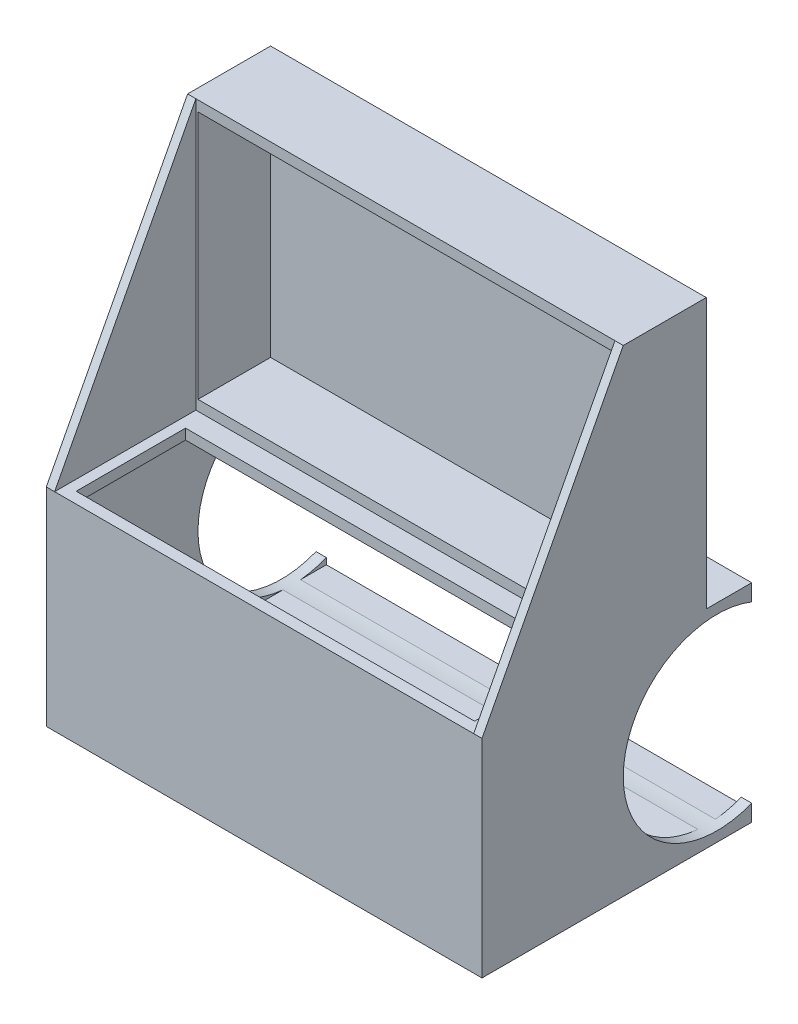
ISO-10303-21;
HEADER;
FILE_DESCRIPTION(('STEP AP214'),'2;1');
FILE_NAME('part.step','',(''),(''),'','','');
FILE_SCHEMA(('AUTOMOTIVE_DESIGN { 1 0 10303 214 1 1 1 1 }'));
ENDSEC;
DATA;
#1=APPLICATION_CONTEXT('core data for automotive mechanical design processes');
#2=APPLICATION_PROTOCOL_DEFINITION('international standard','automotive_design',2000,#1);
#3=PRODUCT_CONTEXT('',#1,'mechanical');
#4=PRODUCT('Part','Part','',(#3));
#5=PRODUCT_RELATED_PRODUCT_CATEGORY('part','',(#4));
#6=PRODUCT_DEFINITION_FORMATION('','',#4);
#7=PRODUCT_DEFINITION_CONTEXT('part definition',#1,'design');
#8=PRODUCT_DEFINITION('design','',#6,#7);
#9=PRODUCT_DEFINITION_SHAPE('','',#8);
#10=(LENGTH_UNIT() NAMED_UNIT(*) SI_UNIT(.MILLI.,.METRE.));
#11=(NAMED_UNIT(*) PLANE_ANGLE_UNIT() SI_UNIT($,.RADIAN.));
#12=(NAMED_UNIT(*) SI_UNIT($,.STERADIAN.) SOLID_ANGLE_UNIT());
#13=UNCERTAINTY_MEASURE_WITH_UNIT(LENGTH_MEASURE(1.E-05),#10,'distance_accuracy_value','');
#14=(GEOMETRIC_REPRESENTATION_CONTEXT(3) GLOBAL_UNCERTAINTY_ASSIGNED_CONTEXT((#13)) GLOBAL_UNIT_ASSIGNED_CONTEXT((#10,
#11,#12)) REPRESENTATION_CONTEXT('',''));
#15=CARTESIAN_POINT('',(0.,0.,0.));
#16=DIRECTION('',(0.,0.,1.));
#17=DIRECTION('',(1.,0.,0.));
#18=AXIS2_PLACEMENT_3D('',#15,#16,#17);
#19=CARTESIAN_POINT('',(-105.,50.,130.));
#20=DIRECTION('',(0.,-1.,0.));
#21=DIRECTION('',(0.,0.,-1.));
#22=AXIS2_PLACEMENT_3D('',#19,#20,#21);
#23=PLANE('',#22);
#24=DIRECTION('',(-1.,0.,0.));
#25=VECTOR('',#24,1.);
#26=CARTESIAN_POINT('',(-96.,50.,71.9000648381955));
#27=LINE('',#26,#25);
#28=CARTESIAN_POINT('',(95.9999999999999,50.,71.9000648381955));
#29=VERTEX_POINT('',#28);
#30=CARTESIAN_POINT('',(-96.,50.,71.9000648381955));
#31=VERTEX_POINT('',#30);
#32=EDGE_CURVE('E297',#29,#31,#27,.T.);
#33=ORIENTED_EDGE('',*,*,#32,.F.);
#34=DIRECTION('',(0.,0.,-1.));
#35=VECTOR('',#34,1.);
#36=CARTESIAN_POINT('',(95.9999999999999,50.,71.9000648381955));
#37=LINE('',#36,#35);
#38=CARTESIAN_POINT('',(96.,50.,124.589762262162));
#39=VERTEX_POINT('',#38);
#40=EDGE_CURVE('E65',#39,#29,#37,.T.);
#41=ORIENTED_EDGE('',*,*,#40,.F.);
#42=DIRECTION('',(1.,0.,0.));
#43=VECTOR('',#42,1.);
#44=CARTESIAN_POINT('',(-96.,50.,124.589762262162));
#45=LINE('',#44,#43);
#46=CARTESIAN_POINT('',(-96.,50.,124.589762262162));
#47=VERTEX_POINT('',#46);
#48=EDGE_CURVE('E288',#47,#39,#45,.T.);
#49=ORIENTED_EDGE('',*,*,#48,.F.);
#50=DIRECTION('',(0.,0.,1.));
#51=VECTOR('',#50,1.);
#52=CARTESIAN_POINT('',(-96.,50.,71.9000648381955));
#53=LINE('',#52,#51);
#54=EDGE_CURVE('E291',#31,#47,#53,.T.);
#55=ORIENTED_EDGE('',*,*,#54,.F.);
#56=EDGE_LOOP('',(#33,#41,#49,#55));
#57=FACE_BOUND('',#56,.T.);
#58=DIRECTION('',(0.,0.,-1.));
#59=VECTOR('',#58,1.);
#60=CARTESIAN_POINT('',(-101.,50.,0.));
#61=LINE('',#60,#59);
#62=CARTESIAN_POINT('',(-101.,50.,130.));
#63=VERTEX_POINT('',#62);
#64=CARTESIAN_POINT('',(-101.,50.,61.9000648381956));
#65=VERTEX_POINT('',#64);
#66=EDGE_CURVE('E312',#63,#65,#61,.T.);
#67=ORIENTED_EDGE('',*,*,#66,.F.);
#68=DIRECTION('',(-1.,0.,0.));
#69=VECTOR('',#68,1.);
#70=CARTESIAN_POINT('',(-105.,50.,130.));
#71=LINE('',#70,#69);
#72=CARTESIAN_POINT('',(101.,50.,130.));
#73=VERTEX_POINT('',#72);
#74=EDGE_CURVE('E487',#73,#63,#71,.T.);
#75=ORIENTED_EDGE('',*,*,#74,.F.);
#76=DIRECTION('',(0.,0.,1.));
#77=VECTOR('',#76,1.);
#78=CARTESIAN_POINT('',(101.,50.,0.));
#79=LINE('',#78,#77);
#80=CARTESIAN_POINT('',(101.,50.,61.9000648381956));
#81=VERTEX_POINT('',#80);
#82=EDGE_CURVE('E322',#81,#73,#79,.T.);
#83=ORIENTED_EDGE('',*,*,#82,.F.);
#84=DIRECTION('',(1.,0.,0.));
#85=VECTOR('',#84,1.);
#86=CARTESIAN_POINT('',(-105.,50.,61.9000648381956));
#87=LINE('',#86,#85);
#88=EDGE_CURVE('E376',#65,#81,#87,.T.);
#89=ORIENTED_EDGE('',*,*,#88,.F.);
#90=EDGE_LOOP('',(#67,#75,#83,#89));
#91=FACE_BOUND('',#90,.T.);
#92=ADVANCED_FACE('F49',(#57,#91),#23,.F.);
#93=CARTESIAN_POINT('',(-105.,50.,61.9000648381956));
#94=DIRECTION('',(0.,0.,1.));
#95=DIRECTION('',(1.,0.,0.));
#96=AXIS2_PLACEMENT_3D('',#93,#94,#95);
#97=PLANE('',#96);
#98=DIRECTION('',(0.,1.,0.));
#99=VECTOR('',#98,1.);
#100=CARTESIAN_POINT('',(99.9999999999999,175.,61.9000648381956));
#101=LINE('',#100,#99);
#102=CARTESIAN_POINT('',(99.9999999999999,55.,61.9000648381956));
#103=VERTEX_POINT('',#102);
#104=CARTESIAN_POINT('',(99.9999999999999,175.,61.9000648381956));
#105=VERTEX_POINT('',#104);
#106=EDGE_CURVE('E331',#103,#105,#101,.T.);
#107=ORIENTED_EDGE('',*,*,#106,.F.);
#108=DIRECTION('',(1.,0.,0.));
#109=VECTOR('',#108,1.);
#110=CARTESIAN_POINT('',(-100.,55.,61.9000648381956));
#111=LINE('',#110,#109);
#112=CARTESIAN_POINT('',(-100.,55.,61.9000648381956));
#113=VERTEX_POINT('',#112);
#114=EDGE_CURVE('E336',#113,#103,#111,.T.);
#115=ORIENTED_EDGE('',*,*,#114,.F.);
#116=DIRECTION('',(0.,-1.,0.));
#117=VECTOR('',#116,1.);
#118=CARTESIAN_POINT('',(-100.,175.,61.9000648381956));
#119=LINE('',#118,#117);
#120=CARTESIAN_POINT('',(-100.,175.,61.9000648381956));
#121=VERTEX_POINT('',#120);
#122=EDGE_CURVE('E350',#121,#113,#119,.T.);
#123=ORIENTED_EDGE('',*,*,#122,.F.);
#124=DIRECTION('',(-1.,0.,0.));
#125=VECTOR('',#124,1.);
#126=CARTESIAN_POINT('',(-100.,175.,61.9000648381956));
#127=LINE('',#126,#125);
#128=EDGE_CURVE('E347',#105,#121,#127,.T.);
#129=ORIENTED_EDGE('',*,*,#128,.F.);
#130=EDGE_LOOP('',(#107,#115,#123,#129));
#131=FACE_BOUND('',#130,.T.);
#132=DIRECTION('',(1.,0.,0.));
#133=VECTOR('',#132,1.);
#134=CARTESIAN_POINT('',(-105.,180.,61.9000648381956));
#135=LINE('',#134,#133);
#136=CARTESIAN_POINT('',(-101.,180.,61.9000648381956));
#137=VERTEX_POINT('',#136);
#138=CARTESIAN_POINT('',(101.,180.,61.9000648381956));
#139=VERTEX_POINT('',#138);
#140=EDGE_CURVE('E382',#137,#139,#135,.T.);
#141=ORIENTED_EDGE('',*,*,#140,.F.);
#142=DIRECTION('',(0.,1.,0.));
#143=VECTOR('',#142,1.);
#144=CARTESIAN_POINT('',(-101.,0.,61.9000648381956));
#145=LINE('',#144,#143);
#146=EDGE_CURVE('E309',#65,#137,#145,.T.);
#147=ORIENTED_EDGE('',*,*,#146,.F.);
#148=ORIENTED_EDGE('',*,*,#88,.T.);
#149=DIRECTION('',(0.,-1.,0.));
#150=VECTOR('',#149,1.);
#151=CARTESIAN_POINT('',(101.,0.,61.9000648381956));
#152=LINE('',#151,#150);
#153=EDGE_CURVE('E324',#139,#81,#152,.T.);
#154=ORIENTED_EDGE('',*,*,#153,.F.);
#155=EDGE_LOOP('',(#141,#147,#148,#154));
#156=FACE_BOUND('',#155,.T.);
#157=ADVANCED_FACE('F587',(#131,#156),#97,.T.);
#158=CARTESIAN_POINT('',(0.,0.,0.));
#159=DIRECTION('',(0.,0.,1.));
#160=DIRECTION('',(1.,0.,0.));
#161=AXIS2_PLACEMENT_3D('',#158,#159,#160);
#162=PLANE('',#161);
#163=DIRECTION('',(0.,-1.,0.));
#164=VECTOR('',#163,1.);
#165=CARTESIAN_POINT('',(-105.,50.,0.));
#166=LINE('',#165,#164);
#167=CARTESIAN_POINT('',(-105.,-42.,0.));
#168=VERTEX_POINT('',#167);
#169=CARTESIAN_POINT('',(-105.,-50.,0.));
#170=VERTEX_POINT('',#169);
#171=EDGE_CURVE('E503',#168,#170,#166,.T.);
#172=ORIENTED_EDGE('',*,*,#171,.F.);
#173=DIRECTION('',(1.,0.,0.));
#174=VECTOR('',#173,1.);
#175=CARTESIAN_POINT('',(-150.,-42.,0.));
#176=LINE('',#175,#174);
#177=CARTESIAN_POINT('',(-100.,-42.,0.));
#178=VERTEX_POINT('',#177);
#179=EDGE_CURVE('E390',#168,#178,#176,.T.);
#180=ORIENTED_EDGE('',*,*,#179,.T.);
#181=DIRECTION('',(0.,-1.,0.));
#182=VECTOR('',#181,1.);
#183=CARTESIAN_POINT('',(-100.,45.,0.));
#184=LINE('',#183,#182);
#185=CARTESIAN_POINT('',(-100.,-45.,0.));
#186=VERTEX_POINT('',#185);
#187=EDGE_CURVE('E464',#178,#186,#184,.T.);
#188=ORIENTED_EDGE('',*,*,#187,.T.);
#189=DIRECTION('',(1.,0.,0.));
#190=VECTOR('',#189,1.);
#191=CARTESIAN_POINT('',(-100.,-45.,0.));
#192=LINE('',#191,#190);
#193=CARTESIAN_POINT('',(100.,-45.,0.));
#194=VERTEX_POINT('',#193);
#195=EDGE_CURVE('E441',#186,#194,#192,.T.);
#196=ORIENTED_EDGE('',*,*,#195,.T.);
#197=DIRECTION('',(0.,-1.,0.));
#198=VECTOR('',#197,1.);
#199=CARTESIAN_POINT('',(100.,45.,0.));
#200=LINE('',#199,#198);
#201=CARTESIAN_POINT('',(100.,-42.,0.));
#202=VERTEX_POINT('',#201);
#203=EDGE_CURVE('E457',#202,#194,#200,.T.);
#204=ORIENTED_EDGE('',*,*,#203,.F.);
#205=CARTESIAN_POINT('',(105.,-42.,0.));
#206=VERTEX_POINT('',#205);
#207=EDGE_CURVE('E378',#202,#206,#176,.T.);
#208=ORIENTED_EDGE('',*,*,#207,.T.);
#209=DIRECTION('',(0.,1.,0.));
#210=VECTOR('',#209,1.);
#211=CARTESIAN_POINT('',(105.,50.,0.));
#212=LINE('',#211,#210);
#213=CARTESIAN_POINT('',(105.,-50.,0.));
#214=VERTEX_POINT('',#213);
#215=EDGE_CURVE('E497',#214,#206,#212,.T.);
#216=ORIENTED_EDGE('',*,*,#215,.F.);
#217=DIRECTION('',(1.,0.,0.));
#218=VECTOR('',#217,1.);
#219=CARTESIAN_POINT('',(-105.,-50.,0.));
#220=LINE('',#219,#218);
#221=EDGE_CURVE('E488',#170,#214,#220,.T.);
#222=ORIENTED_EDGE('',*,*,#221,.F.);
#223=EDGE_LOOP('',(#172,#180,#188,#196,#204,#208,#216,#222));
#224=FACE_BOUND('',#223,.T.);
#225=ADVANCED_FACE('F531',(#224),#162,.F.);
#226=CARTESIAN_POINT('',(-100.,-45.,125.));
#227=DIRECTION('',(0.,1.,0.));
#228=DIRECTION('',(0.,0.,1.));
#229=AXIS2_PLACEMENT_3D('',#226,#227,#228);
#230=PLANE('',#229);
#231=DIRECTION('',(1.,0.,0.));
#232=VECTOR('',#231,1.);
#233=CARTESIAN_POINT('',(-150.,-45.,20.9358842697368));
#234=LINE('',#233,#232);
#235=CARTESIAN_POINT('',(-100.,-45.,20.9358842697368));
#236=VERTEX_POINT('',#235);
#237=CARTESIAN_POINT('',(100.,-45.,20.9358842697368));
#238=VERTEX_POINT('',#237);
#239=EDGE_CURVE('E406',#236,#238,#234,.T.);
#240=ORIENTED_EDGE('',*,*,#239,.F.);
#241=DIRECTION('',(0.,0.,-1.));
#242=VECTOR('',#241,1.);
#243=CARTESIAN_POINT('',(-100.,-45.,125.));
#244=LINE('',#243,#242);
#245=CARTESIAN_POINT('',(-100.,-45.,125.));
#246=VERTEX_POINT('',#245);
#247=EDGE_CURVE('E468',#246,#236,#244,.T.);
#248=ORIENTED_EDGE('',*,*,#247,.F.);
#249=DIRECTION('',(1.,0.,0.));
#250=VECTOR('',#249,1.);
#251=CARTESIAN_POINT('',(-100.,-45.,125.));
#252=LINE('',#251,#250);
#253=CARTESIAN_POINT('',(-35.0000000000001,-45.,125.));
#254=VERTEX_POINT('',#253);
#255=EDGE_CURVE('E442',#246,#254,#252,.T.);
#256=ORIENTED_EDGE('',*,*,#255,.T.);
#257=DIRECTION('',(0.,0.,1.));
#258=VECTOR('',#257,1.);
#259=CARTESIAN_POINT('',(-35.0000000000001,-45.,125.));
#260=LINE('',#259,#258);
#261=CARTESIAN_POINT('',(-35.0000000000001,-45.,40.));
#262=VERTEX_POINT('',#261);
#263=EDGE_CURVE('E417',#262,#254,#260,.T.);
#264=ORIENTED_EDGE('',*,*,#263,.F.);
#265=DIRECTION('',(-1.,0.,0.));
#266=VECTOR('',#265,1.);
#267=CARTESIAN_POINT('',(-100.,-45.,40.));
#268=LINE('',#267,#266);
#269=CARTESIAN_POINT('',(34.9999999999999,-45.,40.));
#270=VERTEX_POINT('',#269);
#271=EDGE_CURVE('E516',#270,#262,#268,.T.);
#272=ORIENTED_EDGE('',*,*,#271,.F.);
#273=DIRECTION('',(0.,0.,-1.));
#274=VECTOR('',#273,1.);
#275=CARTESIAN_POINT('',(34.9999999999999,-45.,125.));
#276=LINE('',#275,#274);
#277=CARTESIAN_POINT('',(35.,-45.,125.));
#278=VERTEX_POINT('',#277);
#279=EDGE_CURVE('E429',#278,#270,#276,.T.);
#280=ORIENTED_EDGE('',*,*,#279,.F.);
#281=CARTESIAN_POINT('',(100.,-45.,125.));
#282=VERTEX_POINT('',#281);
#283=EDGE_CURVE('E446',#278,#282,#252,.T.);
#284=ORIENTED_EDGE('',*,*,#283,.T.);
#285=DIRECTION('',(0.,0.,-1.));
#286=VECTOR('',#285,1.);
#287=CARTESIAN_POINT('',(100.,-45.,125.));
#288=LINE('',#287,#286);
#289=EDGE_CURVE('E480',#282,#238,#288,.T.);
#290=ORIENTED_EDGE('',*,*,#289,.T.);
#291=EDGE_LOOP('',(#240,#248,#256,#264,#272,#280,#284,#290));
#292=FACE_BOUND('',#291,.T.);
#293=ADVANCED_FACE('F552',(#292),#230,.T.);
#294=CARTESIAN_POINT('',(100.,45.,125.));
#295=DIRECTION('',(1.,0.,0.));
#296=DIRECTION('',(0.,0.,-1.));
#297=AXIS2_PLACEMENT_3D('',#294,#295,#296);
#298=PLANE('',#297);
#299=CARTESIAN_POINT('',(100.,45.,0.));
#300=VERTEX_POINT('',#299);
#301=CARTESIAN_POINT('',(100.,42.,0.));
#302=VERTEX_POINT('',#301);
#303=EDGE_CURVE('E458',#300,#302,#200,.T.);
#304=ORIENTED_EDGE('',*,*,#303,.T.);
#305=CARTESIAN_POINT('',(100.,0.,16.701258975879));
#306=DIRECTION('',(1.,0.,0.));
#307=DIRECTION('',(0.,0.,-1.));
#308=AXIS2_PLACEMENT_3D('',#305,#306,#307);
#309=CIRCLE('',#308,45.1988058623165);
#310=CARTESIAN_POINT('',(100.,45.,12.4666336820212));
#311=VERTEX_POINT('',#310);
#312=EDGE_CURVE('E396',#302,#311,#309,.T.);
#313=ORIENTED_EDGE('',*,*,#312,.T.);
#314=DIRECTION('',(0.,0.,-1.));
#315=VECTOR('',#314,1.);
#316=CARTESIAN_POINT('',(100.,45.,125.));
#317=LINE('',#316,#315);
#318=EDGE_CURVE('E475',#311,#300,#317,.T.);
#319=ORIENTED_EDGE('',*,*,#318,.T.);
#320=EDGE_LOOP('',(#304,#313,#319));
#321=FACE_BOUND('',#320,.T.);
#322=ADVANCED_FACE('F633',(#321),#298,.F.);
#323=CARTESIAN_POINT('',(100.,45.,125.));
#324=VERTEX_POINT('',#323);
#325=CARTESIAN_POINT('',(100.,45.,20.9358842697369));
#326=VERTEX_POINT('',#325);
#327=EDGE_CURVE('E476',#324,#326,#317,.T.);
#328=ORIENTED_EDGE('',*,*,#327,.T.);
#329=EDGE_CURVE('E400',#326,#238,#309,.T.);
#330=ORIENTED_EDGE('',*,*,#329,.T.);
#331=ORIENTED_EDGE('',*,*,#289,.F.);
#332=DIRECTION('',(0.,-1.,0.));
#333=VECTOR('',#332,1.);
#334=CARTESIAN_POINT('',(100.,45.,125.));
#335=LINE('',#334,#333);
#336=EDGE_CURVE('E445',#324,#282,#335,.T.);
#337=ORIENTED_EDGE('',*,*,#336,.F.);
#338=EDGE_LOOP('',(#328,#330,#331,#337));
#339=FACE_BOUND('',#338,.T.);
#340=ADVANCED_FACE('F547',(#339),#298,.F.);
#341=CARTESIAN_POINT('',(-100.,45.,125.));
#342=DIRECTION('',(0.,1.,0.));
#343=DIRECTION('',(0.,0.,1.));
#344=AXIS2_PLACEMENT_3D('',#341,#342,#343);
#345=PLANE('',#344);
#346=DIRECTION('',(1.,0.,0.));
#347=VECTOR('',#346,1.);
#348=CARTESIAN_POINT('',(-96.,45.,124.589762262162));
#349=LINE('',#348,#347);
#350=CARTESIAN_POINT('',(-96.,45.,124.589762262162));
#351=VERTEX_POINT('',#350);
#352=CARTESIAN_POINT('',(96.,45.,124.589762262162));
#353=VERTEX_POINT('',#352);
#354=EDGE_CURVE('E278',#351,#353,#349,.T.);
#355=ORIENTED_EDGE('',*,*,#354,.T.);
#356=DIRECTION('',(0.,0.,-1.));
#357=VECTOR('',#356,1.);
#358=CARTESIAN_POINT('',(95.9999999999999,45.,71.9000648381955));
#359=LINE('',#358,#357);
#360=CARTESIAN_POINT('',(95.9999999999999,45.,71.9000648381955));
#361=VERTEX_POINT('',#360);
#362=EDGE_CURVE('E272',#353,#361,#359,.T.);
#363=ORIENTED_EDGE('',*,*,#362,.T.);
#364=DIRECTION('',(-1.,0.,0.));
#365=VECTOR('',#364,1.);
#366=CARTESIAN_POINT('',(-96.,45.,71.9000648381955));
#367=LINE('',#366,#365);
#368=CARTESIAN_POINT('',(-96.,45.,71.9000648381955));
#369=VERTEX_POINT('',#368);
#370=EDGE_CURVE('E281',#361,#369,#367,.T.);
#371=ORIENTED_EDGE('',*,*,#370,.T.);
#372=DIRECTION('',(0.,0.,1.));
#373=VECTOR('',#372,1.);
#374=CARTESIAN_POINT('',(-96.,45.,71.9000648381955));
#375=LINE('',#374,#373);
#376=EDGE_CURVE('E73',#369,#351,#375,.T.);
#377=ORIENTED_EDGE('',*,*,#376,.T.);
#378=EDGE_LOOP('',(#355,#363,#371,#377));
#379=FACE_BOUND('',#378,.T.);
#380=DIRECTION('',(0.,0.,-1.));
#381=VECTOR('',#380,1.);
#382=CARTESIAN_POINT('',(-100.,45.,125.));
#383=LINE('',#382,#381);
#384=CARTESIAN_POINT('',(-100.,45.,125.));
#385=VERTEX_POINT('',#384);
#386=CARTESIAN_POINT('',(-100.,45.,20.9358842697369));
#387=VERTEX_POINT('',#386);
#388=EDGE_CURVE('E472',#385,#387,#383,.T.);
#389=ORIENTED_EDGE('',*,*,#388,.T.);
#390=DIRECTION('',(1.,0.,0.));
#391=VECTOR('',#390,1.);
#392=CARTESIAN_POINT('',(-150.,45.,20.9358842697369));
#393=LINE('',#392,#391);
#394=EDGE_CURVE('E403',#387,#326,#393,.T.);
#395=ORIENTED_EDGE('',*,*,#394,.T.);
#396=ORIENTED_EDGE('',*,*,#327,.F.);
#397=DIRECTION('',(1.,0.,0.));
#398=VECTOR('',#397,1.);
#399=CARTESIAN_POINT('',(-100.,45.,125.));
#400=LINE('',#399,#398);
#401=EDGE_CURVE('E449',#385,#324,#400,.T.);
#402=ORIENTED_EDGE('',*,*,#401,.F.);
#403=EDGE_LOOP('',(#389,#395,#396,#402));
#404=FACE_BOUND('',#403,.T.);
#405=ADVANCED_FACE('F285',(#379,#404),#345,.F.);
#406=CARTESIAN_POINT('',(-100.,45.,125.));
#407=DIRECTION('',(1.,0.,0.));
#408=DIRECTION('',(0.,1.,0.));
#409=AXIS2_PLACEMENT_3D('',#406,#407,#408);
#410=PLANE('',#409);
#411=CARTESIAN_POINT('',(-100.,0.,16.701258975879));
#412=DIRECTION('',(1.,0.,0.));
#413=DIRECTION('',(0.,1.,0.));
#414=AXIS2_PLACEMENT_3D('',#411,#412,#413);
#415=CIRCLE('',#414,45.1988058623165);
#416=EDGE_CURVE('E11',#387,#236,#415,.T.);
#417=ORIENTED_EDGE('',*,*,#416,.F.);
#418=ORIENTED_EDGE('',*,*,#388,.F.);
#419=DIRECTION('',(0.,-1.,0.));
#420=VECTOR('',#419,1.);
#421=CARTESIAN_POINT('',(-100.,45.,125.));
#422=LINE('',#421,#420);
#423=EDGE_CURVE('E452',#385,#246,#422,.T.);
#424=ORIENTED_EDGE('',*,*,#423,.T.);
#425=ORIENTED_EDGE('',*,*,#247,.T.);
#426=EDGE_LOOP('',(#417,#418,#424,#425));
#427=FACE_BOUND('',#426,.T.);
#428=ADVANCED_FACE('F564',(#427),#410,.T.);
#429=CARTESIAN_POINT('',(-100.,-45.,12.4666336820213));
#430=VERTEX_POINT('',#429);
#431=EDGE_CURVE('E58',#430,#178,#415,.T.);
#432=ORIENTED_EDGE('',*,*,#431,.F.);
#433=EDGE_CURVE('E454',#430,#186,#244,.T.);
#434=ORIENTED_EDGE('',*,*,#433,.T.);
#435=ORIENTED_EDGE('',*,*,#187,.F.);
#436=EDGE_LOOP('',(#432,#434,#435));
#437=FACE_BOUND('',#436,.T.);
#438=ADVANCED_FACE('F534',(#437),#410,.T.);
#439=CARTESIAN_POINT('',(105.,42.,0.));
#440=VERTEX_POINT('',#439);
#441=CARTESIAN_POINT('',(105.,50.,0.));
#442=VERTEX_POINT('',#441);
#443=EDGE_CURVE('E483',#440,#442,#212,.T.);
#444=ORIENTED_EDGE('',*,*,#443,.F.);
#445=DIRECTION('',(1.,0.,0.));
#446=VECTOR('',#445,1.);
#447=CARTESIAN_POINT('',(-150.,42.,0.));
#448=LINE('',#447,#446);
#449=EDGE_CURVE('E387',#302,#440,#448,.T.);
#450=ORIENTED_EDGE('',*,*,#449,.F.);
#451=ORIENTED_EDGE('',*,*,#303,.F.);
#452=DIRECTION('',(1.,0.,0.));
#453=VECTOR('',#452,1.);
#454=CARTESIAN_POINT('',(-100.,45.,0.));
#455=LINE('',#454,#453);
#456=CARTESIAN_POINT('',(-100.,45.,0.));
#457=VERTEX_POINT('',#456);
#458=EDGE_CURVE('E461',#457,#300,#455,.T.);
#459=ORIENTED_EDGE('',*,*,#458,.F.);
#460=CARTESIAN_POINT('',(-100.,42.,0.));
#461=VERTEX_POINT('',#460);
#462=EDGE_CURVE('E465',#457,#461,#184,.T.);
#463=ORIENTED_EDGE('',*,*,#462,.T.);
#464=CARTESIAN_POINT('',(-105.,42.,0.));
#465=VERTEX_POINT('',#464);
#466=EDGE_CURVE('E389',#465,#461,#448,.T.);
#467=ORIENTED_EDGE('',*,*,#466,.F.);
#468=CARTESIAN_POINT('',(-105.,50.,0.));
#469=VERTEX_POINT('',#468);
#470=EDGE_CURVE('E504',#469,#465,#166,.T.);
#471=ORIENTED_EDGE('',*,*,#470,.F.);
#472=DIRECTION('',(-1.,0.,0.));
#473=VECTOR('',#472,1.);
#474=CARTESIAN_POINT('',(-105.,50.,0.));
#475=LINE('',#474,#473);
#476=EDGE_CURVE('E500',#442,#469,#475,.T.);
#477=ORIENTED_EDGE('',*,*,#476,.F.);
#478=EDGE_LOOP('',(#444,#450,#451,#459,#463,#467,#471,#477));
#479=FACE_BOUND('',#478,.T.);
#480=ADVANCED_FACE('F605',(#479),#162,.F.);
#481=CARTESIAN_POINT('',(105.,50.,130.));
#482=DIRECTION('',(-1.,0.,0.));
#483=DIRECTION('',(0.,-1.,0.));
#484=AXIS2_PLACEMENT_3D('',#481,#482,#483);
#485=PLANE('',#484);
#486=ORIENTED_EDGE('',*,*,#215,.T.);
#487=CARTESIAN_POINT('',(105.,0.,16.701258975879));
#488=DIRECTION('',(-1.,0.,0.));
#489=DIRECTION('',(0.,-1.,0.));
#490=AXIS2_PLACEMENT_3D('',#487,#488,#489);
#491=CIRCLE('',#490,45.1988058623165);
#492=EDGE_CURVE('E411',#206,#440,#491,.T.);
#493=ORIENTED_EDGE('',*,*,#492,.T.);
#494=ORIENTED_EDGE('',*,*,#443,.T.);
#495=DIRECTION('',(0.,0.,-1.));
#496=VECTOR('',#495,1.);
#497=CARTESIAN_POINT('',(105.,50.,130.));
#498=LINE('',#497,#496);
#499=CARTESIAN_POINT('',(105.,50.,21.9000648381956));
#500=VERTEX_POINT('',#499);
#501=EDGE_CURVE('E515',#500,#442,#498,.T.);
#502=ORIENTED_EDGE('',*,*,#501,.F.);
#503=DIRECTION('',(0.,1.,0.));
#504=VECTOR('',#503,1.);
#505=CARTESIAN_POINT('',(105.,50.,21.9000648381956));
#506=LINE('',#505,#504);
#507=CARTESIAN_POINT('',(105.,180.,21.9000648381956));
#508=VERTEX_POINT('',#507);
#509=EDGE_CURVE('E357',#500,#508,#506,.T.);
#510=ORIENTED_EDGE('',*,*,#509,.T.);
#511=DIRECTION('',(0.,0.,1.));
#512=VECTOR('',#511,1.);
#513=CARTESIAN_POINT('',(105.,180.,21.9000648381956));
#514=LINE('',#513,#512);
#515=CARTESIAN_POINT('',(105.,180.,61.9000648381956));
#516=VERTEX_POINT('',#515);
#517=EDGE_CURVE('E368',#508,#516,#514,.T.);
#518=ORIENTED_EDGE('',*,*,#517,.T.);
#519=DIRECTION('',(0.,0.885818379534539,-0.464032109318745));
#520=VECTOR('',#519,1.);
#521=CARTESIAN_POINT('',(105.,64.2025521706744,122.560054754192));
#522=LINE('',#521,#520);
#523=CARTESIAN_POINT('',(105.,50.,130.));
#524=VERTEX_POINT('',#523);
#525=EDGE_CURVE('E318',#524,#516,#522,.T.);
#526=ORIENTED_EDGE('',*,*,#525,.F.);
#527=DIRECTION('',(0.,1.,0.));
#528=VECTOR('',#527,1.);
#529=CARTESIAN_POINT('',(105.,50.,130.));
#530=LINE('',#529,#528);
#531=CARTESIAN_POINT('',(105.,-50.,130.));
#532=VERTEX_POINT('',#531);
#533=EDGE_CURVE('E484',#532,#524,#530,.T.);
#534=ORIENTED_EDGE('',*,*,#533,.F.);
#535=DIRECTION('',(0.,0.,-1.));
#536=VECTOR('',#535,1.);
#537=CARTESIAN_POINT('',(105.,-50.,130.));
#538=LINE('',#537,#536);
#539=EDGE_CURVE('E496',#532,#214,#538,.T.);
#540=ORIENTED_EDGE('',*,*,#539,.T.);
#541=EDGE_LOOP('',(#486,#493,#494,#502,#510,#518,#526,#534,#540));
#542=FACE_BOUND('',#541,.T.);
#543=ADVANCED_FACE('F51',(#542),#485,.F.);
#544=DIRECTION('',(0.,0.,-1.));
#545=VECTOR('',#544,1.);
#546=CARTESIAN_POINT('',(-105.,50.,130.));
#547=LINE('',#546,#545);
#548=CARTESIAN_POINT('',(-105.,50.,21.9000648381956));
#549=VERTEX_POINT('',#548);
#550=EDGE_CURVE('E513',#549,#469,#547,.T.);
#551=ORIENTED_EDGE('',*,*,#550,.F.);
#552=DIRECTION('',(1.,0.,0.));
#553=VECTOR('',#552,1.);
#554=CARTESIAN_POINT('',(-105.,50.,21.9000648381956));
#555=LINE('',#554,#553);
#556=EDGE_CURVE('E371',#549,#500,#555,.T.);
#557=ORIENTED_EDGE('',*,*,#556,.T.);
#558=ORIENTED_EDGE('',*,*,#501,.T.);
#559=ORIENTED_EDGE('',*,*,#476,.T.);
#560=EDGE_LOOP('',(#551,#557,#558,#559));
#561=FACE_BOUND('',#560,.T.);
#562=ADVANCED_FACE('F589',(#561),#23,.F.);
#563=CARTESIAN_POINT('',(-105.,50.,130.));
#564=DIRECTION('',(1.,0.,0.));
#565=DIRECTION('',(0.,0.,-1.));
#566=AXIS2_PLACEMENT_3D('',#563,#564,#565);
#567=PLANE('',#566);
#568=ORIENTED_EDGE('',*,*,#470,.T.);
#569=CARTESIAN_POINT('',(-105.,0.,16.701258975879));
#570=DIRECTION('',(1.,0.,0.));
#571=DIRECTION('',(0.,0.,-1.));
#572=AXIS2_PLACEMENT_3D('',#569,#570,#571);
#573=CIRCLE('',#572,45.1988058623165);
#574=EDGE_CURVE('E408',#465,#168,#573,.T.);
#575=ORIENTED_EDGE('',*,*,#574,.T.);
#576=ORIENTED_EDGE('',*,*,#171,.T.);
#577=DIRECTION('',(0.,0.,-1.));
#578=VECTOR('',#577,1.);
#579=CARTESIAN_POINT('',(-105.,-50.,130.));
#580=LINE('',#579,#578);
#581=CARTESIAN_POINT('',(-105.,-50.,130.));
#582=VERTEX_POINT('',#581);
#583=EDGE_CURVE('E510',#582,#170,#580,.T.);
#584=ORIENTED_EDGE('',*,*,#583,.F.);
#585=DIRECTION('',(0.,-1.,0.));
#586=VECTOR('',#585,1.);
#587=CARTESIAN_POINT('',(-105.,50.,130.));
#588=LINE('',#587,#586);
#589=CARTESIAN_POINT('',(-105.,50.,130.));
#590=VERTEX_POINT('',#589);
#591=EDGE_CURVE('E492',#590,#582,#588,.T.);
#592=ORIENTED_EDGE('',*,*,#591,.F.);
#593=DIRECTION('',(0.,-0.885818379534539,0.464032109318745));
#594=VECTOR('',#593,1.);
#595=CARTESIAN_POINT('',(-105.,64.2025521706744,122.560054754192));
#596=LINE('',#595,#594);
#597=CARTESIAN_POINT('',(-105.,180.,61.9000648381956));
#598=VERTEX_POINT('',#597);
#599=EDGE_CURVE('E303',#598,#590,#596,.T.);
#600=ORIENTED_EDGE('',*,*,#599,.F.);
#601=DIRECTION('',(0.,0.,1.));
#602=VECTOR('',#601,1.);
#603=CARTESIAN_POINT('',(-105.,180.,21.9000648381956));
#604=LINE('',#603,#602);
#605=CARTESIAN_POINT('',(-105.,180.,21.9000648381956));
#606=VERTEX_POINT('',#605);
#607=EDGE_CURVE('E367',#606,#598,#604,.T.);
#608=ORIENTED_EDGE('',*,*,#607,.F.);
#609=DIRECTION('',(0.,1.,0.));
#610=VECTOR('',#609,1.);
#611=CARTESIAN_POINT('',(-105.,50.,21.9000648381956));
#612=LINE('',#611,#610);
#613=EDGE_CURVE('E364',#549,#606,#612,.T.);
#614=ORIENTED_EDGE('',*,*,#613,.F.);
#615=ORIENTED_EDGE('',*,*,#550,.T.);
#616=EDGE_LOOP('',(#568,#575,#576,#584,#592,#600,#608,#614,#615));
#617=FACE_BOUND('',#616,.T.);
#618=ADVANCED_FACE('F598',(#617),#567,.F.);
#619=CARTESIAN_POINT('',(-105.,-50.,130.));
#620=DIRECTION('',(0.,1.,0.));
#621=DIRECTION('',(0.,0.,1.));
#622=AXIS2_PLACEMENT_3D('',#619,#620,#621);
#623=PLANE('',#622);
#624=DIRECTION('',(1.,0.,0.));
#625=VECTOR('',#624,1.);
#626=CARTESIAN_POINT('',(-105.,-50.,125.));
#627=LINE('',#626,#625);
#628=CARTESIAN_POINT('',(-35.0000000000001,-50.,125.));
#629=VERTEX_POINT('',#628);
#630=CARTESIAN_POINT('',(35.,-50.,125.));
#631=VERTEX_POINT('',#630);
#632=EDGE_CURVE('E438',#629,#631,#627,.T.);
#633=ORIENTED_EDGE('',*,*,#632,.T.);
#634=DIRECTION('',(0.,0.,-1.));
#635=VECTOR('',#634,1.);
#636=CARTESIAN_POINT('',(35.,-50.,130.));
#637=LINE('',#636,#635);
#638=CARTESIAN_POINT('',(34.9999999999999,-50.,40.));
#639=VERTEX_POINT('',#638);
#640=EDGE_CURVE('E432',#631,#639,#637,.T.);
#641=ORIENTED_EDGE('',*,*,#640,.T.);
#642=DIRECTION('',(-1.,0.,0.));
#643=VECTOR('',#642,1.);
#644=CARTESIAN_POINT('',(-105.,-50.,40.));
#645=LINE('',#644,#643);
#646=CARTESIAN_POINT('',(-35.0000000000001,-50.,40.));
#647=VERTEX_POINT('',#646);
#648=EDGE_CURVE('E435',#639,#647,#645,.T.);
#649=ORIENTED_EDGE('',*,*,#648,.T.);
#650=DIRECTION('',(0.,0.,1.));
#651=VECTOR('',#650,1.);
#652=CARTESIAN_POINT('',(-35.0000000000001,-50.,130.));
#653=LINE('',#652,#651);
#654=EDGE_CURVE('E426',#647,#629,#653,.T.);
#655=ORIENTED_EDGE('',*,*,#654,.T.);
#656=EDGE_LOOP('',(#633,#641,#649,#655));
#657=FACE_BOUND('',#656,.T.);
#658=ORIENTED_EDGE('',*,*,#221,.T.);
#659=ORIENTED_EDGE('',*,*,#539,.F.);
#660=DIRECTION('',(1.,0.,0.));
#661=VECTOR('',#660,1.);
#662=CARTESIAN_POINT('',(-105.,-50.,130.));
#663=LINE('',#662,#661);
#664=EDGE_CURVE('E494',#582,#532,#663,.T.);
#665=ORIENTED_EDGE('',*,*,#664,.F.);
#666=ORIENTED_EDGE('',*,*,#583,.T.);
#667=EDGE_LOOP('',(#658,#659,#665,#666));
#668=FACE_BOUND('',#667,.T.);
#669=ADVANCED_FACE('F571',(#657,#668),#623,.F.);
#670=CARTESIAN_POINT('',(0.,0.,130.));
#671=DIRECTION('',(0.,0.,1.));
#672=DIRECTION('',(1.,0.,0.));
#673=AXIS2_PLACEMENT_3D('',#670,#671,#672);
#674=PLANE('',#673);
#675=ORIENTED_EDGE('',*,*,#533,.T.);
#676=EDGE_CURVE('E489',#524,#73,#71,.T.);
#677=ORIENTED_EDGE('',*,*,#676,.T.);
#678=ORIENTED_EDGE('',*,*,#74,.T.);
#679=DIRECTION('',(-1.,0.,0.));
#680=VECTOR('',#679,1.);
#681=CARTESIAN_POINT('',(-101.,50.,130.));
#682=LINE('',#681,#680);
#683=EDGE_CURVE('E314',#63,#590,#682,.T.);
#684=ORIENTED_EDGE('',*,*,#683,.T.);
#685=ORIENTED_EDGE('',*,*,#591,.T.);
#686=ORIENTED_EDGE('',*,*,#664,.T.);
#687=EDGE_LOOP('',(#675,#677,#678,#684,#685,#686));
#688=FACE_BOUND('',#687,.T.);
#689=ADVANCED_FACE('F647',(#688),#674,.T.);
#690=DIRECTION('',(1.,0.,0.));
#691=VECTOR('',#690,1.);
#692=CARTESIAN_POINT('',(-150.,-45.,12.4666336820213));
#693=LINE('',#692,#691);
#694=CARTESIAN_POINT('',(100.,-45.,12.4666336820213));
#695=VERTEX_POINT('',#694);
#696=EDGE_CURVE('E399',#695,#430,#693,.F.);
#697=ORIENTED_EDGE('',*,*,#696,.F.);
#698=EDGE_CURVE('E479',#695,#194,#288,.T.);
#699=ORIENTED_EDGE('',*,*,#698,.T.);
#700=ORIENTED_EDGE('',*,*,#195,.F.);
#701=ORIENTED_EDGE('',*,*,#433,.F.);
#702=EDGE_LOOP('',(#697,#699,#700,#701));
#703=FACE_BOUND('',#702,.T.);
#704=ADVANCED_FACE('F536',(#703),#230,.T.);
#705=ORIENTED_EDGE('',*,*,#698,.F.);
#706=EDGE_CURVE('E401',#695,#202,#309,.T.);
#707=ORIENTED_EDGE('',*,*,#706,.T.);
#708=ORIENTED_EDGE('',*,*,#203,.T.);
#709=EDGE_LOOP('',(#705,#707,#708));
#710=FACE_BOUND('',#709,.T.);
#711=ADVANCED_FACE('F543',(#710),#298,.F.);
#712=ORIENTED_EDGE('',*,*,#318,.F.);
#713=DIRECTION('',(1.,0.,0.));
#714=VECTOR('',#713,1.);
#715=CARTESIAN_POINT('',(-150.,45.,12.4666336820212));
#716=LINE('',#715,#714);
#717=CARTESIAN_POINT('',(-100.,45.,12.4666336820212));
#718=VERTEX_POINT('',#717);
#719=EDGE_CURVE('E393',#311,#718,#716,.F.);
#720=ORIENTED_EDGE('',*,*,#719,.T.);
#721=EDGE_CURVE('E471',#718,#457,#383,.T.);
#722=ORIENTED_EDGE('',*,*,#721,.T.);
#723=ORIENTED_EDGE('',*,*,#458,.T.);
#724=EDGE_LOOP('',(#712,#720,#722,#723));
#725=FACE_BOUND('',#724,.T.);
#726=ADVANCED_FACE('F630',(#725),#345,.F.);
#727=EDGE_CURVE('E53',#461,#718,#415,.T.);
#728=ORIENTED_EDGE('',*,*,#727,.F.);
#729=ORIENTED_EDGE('',*,*,#462,.F.);
#730=ORIENTED_EDGE('',*,*,#721,.F.);
#731=EDGE_LOOP('',(#728,#729,#730));
#732=FACE_BOUND('',#731,.T.);
#733=ADVANCED_FACE('F627',(#732),#410,.T.);
#734=CARTESIAN_POINT('',(0.,0.,125.));
#735=DIRECTION('',(0.,0.,-1.));
#736=DIRECTION('',(-1.,0.,0.));
#737=AXIS2_PLACEMENT_3D('',#734,#735,#736);
#738=PLANE('',#737);
#739=ORIENTED_EDGE('',*,*,#283,.F.);
#740=DIRECTION('',(0.,1.,0.));
#741=VECTOR('',#740,1.);
#742=CARTESIAN_POINT('',(35.,-125.,125.));
#743=LINE('',#742,#741);
#744=EDGE_CURVE('E415',#631,#278,#743,.T.);
#745=ORIENTED_EDGE('',*,*,#744,.F.);
#746=ORIENTED_EDGE('',*,*,#632,.F.);
#747=DIRECTION('',(0.,1.,0.));
#748=VECTOR('',#747,1.);
#749=CARTESIAN_POINT('',(-35.0000000000001,-125.,125.));
#750=LINE('',#749,#748);
#751=EDGE_CURVE('E418',#629,#254,#750,.T.);
#752=ORIENTED_EDGE('',*,*,#751,.T.);
#753=ORIENTED_EDGE('',*,*,#255,.F.);
#754=ORIENTED_EDGE('',*,*,#423,.F.);
#755=ORIENTED_EDGE('',*,*,#401,.T.);
#756=ORIENTED_EDGE('',*,*,#336,.T.);
#757=EDGE_LOOP('',(#739,#745,#746,#752,#753,#754,#755,#756));
#758=FACE_BOUND('',#757,.T.);
#759=ADVANCED_FACE('F558',(#758),#738,.T.);
#760=CARTESIAN_POINT('',(-35.0000000000001,-125.,40.));
#761=DIRECTION('',(0.,0.,-1.));
#762=DIRECTION('',(-1.,0.,0.));
#763=AXIS2_PLACEMENT_3D('',#760,#761,#762);
#764=PLANE('',#763);
#765=DIRECTION('',(0.,1.,0.));
#766=VECTOR('',#765,1.);
#767=CARTESIAN_POINT('',(34.9999999999999,-125.,40.));
#768=LINE('',#767,#766);
#769=EDGE_CURVE('E414',#639,#270,#768,.T.);
#770=ORIENTED_EDGE('',*,*,#769,.T.);
#771=ORIENTED_EDGE('',*,*,#271,.T.);
#772=DIRECTION('',(0.,1.,0.));
#773=VECTOR('',#772,1.);
#774=CARTESIAN_POINT('',(-35.0000000000001,-125.,40.));
#775=LINE('',#774,#773);
#776=EDGE_CURVE('E421',#647,#262,#775,.T.);
#777=ORIENTED_EDGE('',*,*,#776,.F.);
#778=ORIENTED_EDGE('',*,*,#648,.F.);
#779=EDGE_LOOP('',(#770,#771,#777,#778));
#780=FACE_BOUND('',#779,.T.);
#781=ADVANCED_FACE('F574',(#780),#764,.F.);
#782=CARTESIAN_POINT('',(34.9999999999999,-125.,40.));
#783=DIRECTION('',(1.,0.,0.));
#784=DIRECTION('',(0.,0.,-1.));
#785=AXIS2_PLACEMENT_3D('',#782,#783,#784);
#786=PLANE('',#785);
#787=ORIENTED_EDGE('',*,*,#744,.T.);
#788=ORIENTED_EDGE('',*,*,#279,.T.);
#789=ORIENTED_EDGE('',*,*,#769,.F.);
#790=ORIENTED_EDGE('',*,*,#640,.F.);
#791=EDGE_LOOP('',(#787,#788,#789,#790));
#792=FACE_BOUND('',#791,.T.);
#793=ADVANCED_FACE('F576',(#792),#786,.F.);
#794=CARTESIAN_POINT('',(-35.0000000000001,-125.,40.));
#795=DIRECTION('',(-1.,0.,0.));
#796=DIRECTION('',(0.,0.,1.));
#797=AXIS2_PLACEMENT_3D('',#794,#795,#796);
#798=PLANE('',#797);
#799=ORIENTED_EDGE('',*,*,#776,.T.);
#800=ORIENTED_EDGE('',*,*,#263,.T.);
#801=ORIENTED_EDGE('',*,*,#751,.F.);
#802=ORIENTED_EDGE('',*,*,#654,.F.);
#803=EDGE_LOOP('',(#799,#800,#801,#802));
#804=FACE_BOUND('',#803,.T.);
#805=ADVANCED_FACE('F569',(#804),#798,.F.);
#806=CARTESIAN_POINT('',(-150.,0.,16.701258975879));
#807=DIRECTION('',(1.,0.,0.));
#808=DIRECTION('',(0.,0.,-1.));
#809=AXIS2_PLACEMENT_3D('',#806,#807,#808);
#810=CYLINDRICAL_SURFACE('',#809,45.1988058623165);
#811=ORIENTED_EDGE('',*,*,#239,.T.);
#812=ORIENTED_EDGE('',*,*,#329,.F.);
#813=ORIENTED_EDGE('',*,*,#394,.F.);
#814=ORIENTED_EDGE('',*,*,#416,.T.);
#815=EDGE_LOOP('',(#811,#812,#813,#814));
#816=FACE_BOUND('',#815,.T.);
#817=ORIENTED_EDGE('',*,*,#207,.F.);
#818=ORIENTED_EDGE('',*,*,#706,.F.);
#819=ORIENTED_EDGE('',*,*,#696,.T.);
#820=ORIENTED_EDGE('',*,*,#431,.T.);
#821=ORIENTED_EDGE('',*,*,#179,.F.);
#822=ORIENTED_EDGE('',*,*,#574,.F.);
#823=ORIENTED_EDGE('',*,*,#466,.T.);
#824=ORIENTED_EDGE('',*,*,#727,.T.);
#825=ORIENTED_EDGE('',*,*,#719,.F.);
#826=ORIENTED_EDGE('',*,*,#312,.F.);
#827=ORIENTED_EDGE('',*,*,#449,.T.);
#828=ORIENTED_EDGE('',*,*,#492,.F.);
#829=EDGE_LOOP('',(#817,#818,#819,#820,#821,#822,#823,#824,#825,#826,#827,#828));
#830=FACE_BOUND('',#829,.T.);
#831=ADVANCED_FACE('F523',(#816,#830),#810,.F.);
#832=CARTESIAN_POINT('',(-105.,180.,21.9000648381956));
#833=DIRECTION('',(0.,1.,0.));
#834=DIRECTION('',(-1.,0.,0.));
#835=AXIS2_PLACEMENT_3D('',#832,#833,#834);
#836=PLANE('',#835);
#837=ORIENTED_EDGE('',*,*,#517,.F.);
#838=DIRECTION('',(1.,0.,0.));
#839=VECTOR('',#838,1.);
#840=CARTESIAN_POINT('',(-105.,180.,21.9000648381956));
#841=LINE('',#840,#839);
#842=EDGE_CURVE('E383',#606,#508,#841,.T.);
#843=ORIENTED_EDGE('',*,*,#842,.F.);
#844=ORIENTED_EDGE('',*,*,#607,.T.);
#845=EDGE_CURVE('E379',#598,#137,#135,.T.);
#846=ORIENTED_EDGE('',*,*,#845,.T.);
#847=ORIENTED_EDGE('',*,*,#140,.T.);
#848=DIRECTION('',(1.,0.,0.));
#849=VECTOR('',#848,1.);
#850=CARTESIAN_POINT('',(101.,180.,61.9000648381956));
#851=LINE('',#850,#849);
#852=EDGE_CURVE('E327',#139,#516,#851,.T.);
#853=ORIENTED_EDGE('',*,*,#852,.T.);
#854=EDGE_LOOP('',(#837,#843,#844,#846,#847,#853));
#855=FACE_BOUND('',#854,.T.);
#856=ADVANCED_FACE('F670',(#855),#836,.T.);
#857=CARTESIAN_POINT('',(-105.,50.,21.9000648381956));
#858=DIRECTION('',(0.,0.,-1.));
#859=DIRECTION('',(-1.,0.,0.));
#860=AXIS2_PLACEMENT_3D('',#857,#858,#859);
#861=PLANE('',#860);
#862=ORIENTED_EDGE('',*,*,#509,.F.);
#863=ORIENTED_EDGE('',*,*,#556,.F.);
#864=ORIENTED_EDGE('',*,*,#613,.T.);
#865=ORIENTED_EDGE('',*,*,#842,.T.);
#866=EDGE_LOOP('',(#862,#863,#864,#865));
#867=FACE_BOUND('',#866,.T.);
#868=ADVANCED_FACE('F615',(#867),#861,.T.);
#869=CARTESIAN_POINT('',(99.9999999999999,175.,26.9000648381956));
#870=DIRECTION('',(1.,0.,0.));
#871=DIRECTION('',(0.,1.,0.));
#872=AXIS2_PLACEMENT_3D('',#869,#870,#871);
#873=PLANE('',#872);
#874=ORIENTED_EDGE('',*,*,#106,.T.);
#875=DIRECTION('',(0.,0.,1.));
#876=VECTOR('',#875,1.);
#877=CARTESIAN_POINT('',(99.9999999999999,175.,26.9000648381956));
#878=LINE('',#877,#876);
#879=CARTESIAN_POINT('',(99.9999999999999,175.,26.9000648381956));
#880=VERTEX_POINT('',#879);
#881=EDGE_CURVE('E345',#880,#105,#878,.T.);
#882=ORIENTED_EDGE('',*,*,#881,.F.);
#883=DIRECTION('',(0.,1.,0.));
#884=VECTOR('',#883,1.);
#885=CARTESIAN_POINT('',(99.9999999999999,175.,26.9000648381956));
#886=LINE('',#885,#884);
#887=CARTESIAN_POINT('',(99.9999999999999,55.,26.9000648381956));
#888=VERTEX_POINT('',#887);
#889=EDGE_CURVE('E332',#888,#880,#886,.T.);
#890=ORIENTED_EDGE('',*,*,#889,.F.);
#891=DIRECTION('',(0.,0.,1.));
#892=VECTOR('',#891,1.);
#893=CARTESIAN_POINT('',(99.9999999999999,55.,26.9000648381956));
#894=LINE('',#893,#892);
#895=EDGE_CURVE('E355',#888,#103,#894,.T.);
#896=ORIENTED_EDGE('',*,*,#895,.T.);
#897=EDGE_LOOP('',(#874,#882,#890,#896));
#898=FACE_BOUND('',#897,.T.);
#899=ADVANCED_FACE('F680',(#898),#873,.F.);
#900=CARTESIAN_POINT('',(-100.,55.,26.9000648381956));
#901=DIRECTION('',(0.,-1.,0.));
#902=DIRECTION('',(0.,0.,-1.));
#903=AXIS2_PLACEMENT_3D('',#900,#901,#902);
#904=PLANE('',#903);
#905=ORIENTED_EDGE('',*,*,#114,.T.);
#906=ORIENTED_EDGE('',*,*,#895,.F.);
#907=DIRECTION('',(1.,0.,0.));
#908=VECTOR('',#907,1.);
#909=CARTESIAN_POINT('',(-100.,55.,26.9000648381956));
#910=LINE('',#909,#908);
#911=CARTESIAN_POINT('',(-100.,55.,26.9000648381956));
#912=VERTEX_POINT('',#911);
#913=EDGE_CURVE('E342',#912,#888,#910,.T.);
#914=ORIENTED_EDGE('',*,*,#913,.F.);
#915=DIRECTION('',(0.,0.,1.));
#916=VECTOR('',#915,1.);
#917=CARTESIAN_POINT('',(-100.,55.,26.9000648381956));
#918=LINE('',#917,#916);
#919=EDGE_CURVE('E358',#912,#113,#918,.T.);
#920=ORIENTED_EDGE('',*,*,#919,.T.);
#921=EDGE_LOOP('',(#905,#906,#914,#920));
#922=FACE_BOUND('',#921,.T.);
#923=ADVANCED_FACE('F687',(#922),#904,.F.);
#924=CARTESIAN_POINT('',(-100.,175.,26.9000648381956));
#925=DIRECTION('',(-1.,0.,0.));
#926=DIRECTION('',(0.,-1.,0.));
#927=AXIS2_PLACEMENT_3D('',#924,#925,#926);
#928=PLANE('',#927);
#929=ORIENTED_EDGE('',*,*,#122,.T.);
#930=ORIENTED_EDGE('',*,*,#919,.F.);
#931=DIRECTION('',(0.,-1.,0.));
#932=VECTOR('',#931,1.);
#933=CARTESIAN_POINT('',(-100.,175.,26.9000648381956));
#934=LINE('',#933,#932);
#935=CARTESIAN_POINT('',(-100.,175.,26.9000648381956));
#936=VERTEX_POINT('',#935);
#937=EDGE_CURVE('E339',#936,#912,#934,.T.);
#938=ORIENTED_EDGE('',*,*,#937,.F.);
#939=DIRECTION('',(0.,0.,1.));
#940=VECTOR('',#939,1.);
#941=CARTESIAN_POINT('',(-100.,175.,26.9000648381956));
#942=LINE('',#941,#940);
#943=EDGE_CURVE('E360',#936,#121,#942,.T.);
#944=ORIENTED_EDGE('',*,*,#943,.T.);
#945=EDGE_LOOP('',(#929,#930,#938,#944));
#946=FACE_BOUND('',#945,.T.);
#947=ADVANCED_FACE('F751',(#946),#928,.F.);
#948=CARTESIAN_POINT('',(-100.,175.,26.9000648381956));
#949=DIRECTION('',(0.,1.,0.));
#950=DIRECTION('',(0.,0.,1.));
#951=AXIS2_PLACEMENT_3D('',#948,#949,#950);
#952=PLANE('',#951);
#953=ORIENTED_EDGE('',*,*,#128,.T.);
#954=ORIENTED_EDGE('',*,*,#943,.F.);
#955=DIRECTION('',(-1.,0.,0.));
#956=VECTOR('',#955,1.);
#957=CARTESIAN_POINT('',(-100.,175.,26.9000648381956));
#958=LINE('',#957,#956);
#959=EDGE_CURVE('E335',#880,#936,#958,.T.);
#960=ORIENTED_EDGE('',*,*,#959,.F.);
#961=ORIENTED_EDGE('',*,*,#881,.T.);
#962=EDGE_LOOP('',(#953,#954,#960,#961));
#963=FACE_BOUND('',#962,.T.);
#964=ADVANCED_FACE('F760',(#963),#952,.F.);
#965=CARTESIAN_POINT('',(0.,0.,26.9000648381956));
#966=DIRECTION('',(0.,0.,1.));
#967=DIRECTION('',(1.,0.,0.));
#968=AXIS2_PLACEMENT_3D('',#965,#966,#967);
#969=PLANE('',#968);
#970=ORIENTED_EDGE('',*,*,#889,.T.);
#971=ORIENTED_EDGE('',*,*,#959,.T.);
#972=ORIENTED_EDGE('',*,*,#937,.T.);
#973=ORIENTED_EDGE('',*,*,#913,.T.);
#974=EDGE_LOOP('',(#970,#971,#972,#973));
#975=FACE_BOUND('',#974,.T.);
#976=ADVANCED_FACE('F697',(#975),#969,.T.);
#977=CARTESIAN_POINT('',(101.,64.2025521706744,122.560054754192));
#978=DIRECTION('',(0.,-0.464032109318745,-0.885818379534539));
#979=DIRECTION('',(0.,0.885818379534539,-0.464032109318745));
#980=AXIS2_PLACEMENT_3D('',#977,#978,#979);
#981=PLANE('',#980);
#982=ORIENTED_EDGE('',*,*,#525,.T.);
#983=ORIENTED_EDGE('',*,*,#852,.F.);
#984=DIRECTION('',(0.,0.885818379534539,-0.464032109318745));
#985=VECTOR('',#984,1.);
#986=CARTESIAN_POINT('',(101.,64.2025521706744,122.560054754192));
#987=LINE('',#986,#985);
#988=EDGE_CURVE('E319',#73,#139,#987,.T.);
#989=ORIENTED_EDGE('',*,*,#988,.F.);
#990=ORIENTED_EDGE('',*,*,#676,.F.);
#991=EDGE_LOOP('',(#982,#983,#989,#990));
#992=FACE_BOUND('',#991,.T.);
#993=ADVANCED_FACE('F693',(#992),#981,.F.);
#994=CARTESIAN_POINT('',(101.,0.,0.));
#995=DIRECTION('',(1.,0.,0.));
#996=DIRECTION('',(0.,1.,0.));
#997=AXIS2_PLACEMENT_3D('',#994,#995,#996);
#998=PLANE('',#997);
#999=ORIENTED_EDGE('',*,*,#988,.T.);
#1000=ORIENTED_EDGE('',*,*,#153,.T.);
#1001=ORIENTED_EDGE('',*,*,#82,.T.);
#1002=EDGE_LOOP('',(#999,#1000,#1001));
#1003=FACE_BOUND('',#1002,.T.);
#1004=ADVANCED_FACE('F696',(#1003),#998,.F.);
#1005=CARTESIAN_POINT('',(-101.,64.2025521706744,122.560054754192));
#1006=DIRECTION('',(0.,-0.464032109318745,-0.885818379534539));
#1007=DIRECTION('',(0.,0.885818379534539,-0.464032109318745));
#1008=AXIS2_PLACEMENT_3D('',#1005,#1006,#1007);
#1009=PLANE('',#1008);
#1010=ORIENTED_EDGE('',*,*,#599,.T.);
#1011=ORIENTED_EDGE('',*,*,#683,.F.);
#1012=DIRECTION('',(0.,-0.885818379534539,0.464032109318745));
#1013=VECTOR('',#1012,1.);
#1014=CARTESIAN_POINT('',(-101.,64.2025521706744,122.560054754192));
#1015=LINE('',#1014,#1013);
#1016=EDGE_CURVE('E307',#137,#63,#1015,.T.);
#1017=ORIENTED_EDGE('',*,*,#1016,.F.);
#1018=ORIENTED_EDGE('',*,*,#845,.F.);
#1019=EDGE_LOOP('',(#1010,#1011,#1017,#1018));
#1020=FACE_BOUND('',#1019,.T.);
#1021=ADVANCED_FACE('F705',(#1020),#1009,.F.);
#1022=CARTESIAN_POINT('',(-101.,0.,0.));
#1023=DIRECTION('',(-1.,0.,0.));
#1024=DIRECTION('',(0.,0.,1.));
#1025=AXIS2_PLACEMENT_3D('',#1022,#1023,#1024);
#1026=PLANE('',#1025);
#1027=ORIENTED_EDGE('',*,*,#1016,.T.);
#1028=ORIENTED_EDGE('',*,*,#66,.T.);
#1029=ORIENTED_EDGE('',*,*,#146,.T.);
#1030=EDGE_LOOP('',(#1027,#1028,#1029));
#1031=FACE_BOUND('',#1030,.T.);
#1032=ADVANCED_FACE('F713',(#1031),#1026,.F.);
#1033=CARTESIAN_POINT('',(95.9999999999999,45.,71.9000648381955));
#1034=DIRECTION('',(1.,0.,0.));
#1035=DIRECTION('',(0.,0.,-1.));
#1036=AXIS2_PLACEMENT_3D('',#1033,#1034,#1035);
#1037=PLANE('',#1036);
#1038=ORIENTED_EDGE('',*,*,#40,.T.);
#1039=DIRECTION('',(0.,1.,0.));
#1040=VECTOR('',#1039,1.);
#1041=CARTESIAN_POINT('',(95.9999999999999,45.,71.9000648381955));
#1042=LINE('',#1041,#1040);
#1043=EDGE_CURVE('E268',#361,#29,#1042,.T.);
#1044=ORIENTED_EDGE('',*,*,#1043,.F.);
#1045=ORIENTED_EDGE('',*,*,#362,.F.);
#1046=DIRECTION('',(0.,1.,0.));
#1047=VECTOR('',#1046,1.);
#1048=CARTESIAN_POINT('',(96.,45.,124.589762262162));
#1049=LINE('',#1048,#1047);
#1050=EDGE_CURVE('E301',#353,#39,#1049,.T.);
#1051=ORIENTED_EDGE('',*,*,#1050,.T.);
#1052=EDGE_LOOP('',(#1038,#1044,#1045,#1051));
#1053=FACE_BOUND('',#1052,.T.);
#1054=ADVANCED_FACE('F270',(#1053),#1037,.F.);
#1055=CARTESIAN_POINT('',(-96.,45.,124.589762262162));
#1056=DIRECTION('',(0.,0.,1.));
#1057=DIRECTION('',(1.,0.,0.));
#1058=AXIS2_PLACEMENT_3D('',#1055,#1056,#1057);
#1059=PLANE('',#1058);
#1060=ORIENTED_EDGE('',*,*,#48,.T.);
#1061=ORIENTED_EDGE('',*,*,#1050,.F.);
#1062=ORIENTED_EDGE('',*,*,#354,.F.);
#1063=DIRECTION('',(0.,1.,0.));
#1064=VECTOR('',#1063,1.);
#1065=CARTESIAN_POINT('',(-96.,45.,124.589762262162));
#1066=LINE('',#1065,#1064);
#1067=EDGE_CURVE('E304',#351,#47,#1066,.T.);
#1068=ORIENTED_EDGE('',*,*,#1067,.T.);
#1069=EDGE_LOOP('',(#1060,#1061,#1062,#1068));
#1070=FACE_BOUND('',#1069,.T.);
#1071=ADVANCED_FACE('F833',(#1070),#1059,.F.);
#1072=CARTESIAN_POINT('',(-96.,45.,71.9000648381955));
#1073=DIRECTION('',(-1.,0.,0.));
#1074=DIRECTION('',(0.,0.,1.));
#1075=AXIS2_PLACEMENT_3D('',#1072,#1073,#1074);
#1076=PLANE('',#1075);
#1077=ORIENTED_EDGE('',*,*,#54,.T.);
#1078=ORIENTED_EDGE('',*,*,#1067,.F.);
#1079=ORIENTED_EDGE('',*,*,#376,.F.);
#1080=DIRECTION('',(0.,1.,0.));
#1081=VECTOR('',#1080,1.);
#1082=CARTESIAN_POINT('',(-96.,45.,71.9000648381955));
#1083=LINE('',#1082,#1081);
#1084=EDGE_CURVE('E277',#369,#31,#1083,.T.);
#1085=ORIENTED_EDGE('',*,*,#1084,.T.);
#1086=EDGE_LOOP('',(#1077,#1078,#1079,#1085));
#1087=FACE_BOUND('',#1086,.T.);
#1088=ADVANCED_FACE('F843',(#1087),#1076,.F.);
#1089=CARTESIAN_POINT('',(-96.,45.,71.9000648381955));
#1090=DIRECTION('',(0.,0.,-1.));
#1091=DIRECTION('',(-1.,0.,0.));
#1092=AXIS2_PLACEMENT_3D('',#1089,#1090,#1091);
#1093=PLANE('',#1092);
#1094=ORIENTED_EDGE('',*,*,#32,.T.);
#1095=ORIENTED_EDGE('',*,*,#1084,.F.);
#1096=ORIENTED_EDGE('',*,*,#370,.F.);
#1097=ORIENTED_EDGE('',*,*,#1043,.T.);
#1098=EDGE_LOOP('',(#1094,#1095,#1096,#1097));
#1099=FACE_BOUND('',#1098,.T.);
#1100=ADVANCED_FACE('F282',(#1099),#1093,.F.);
#1101=CLOSED_SHELL('',(#92,#157,#225,#293,#322,#340,#405,#428,#438,#480,#543,#562,#618,#669,
#689,#704,#711,#726,#733,#759,#781,#793,#805,#831,#856,#868,#899,#923,#947,#964,#976,#993,#1004,
#1021,#1032,#1054,#1071,#1088,#1100));
#1102=MANIFOLD_SOLID_BREP('B2',#1101);
#1103=ADVANCED_BREP_SHAPE_REPRESENTATION('',(#18,#1102),#14);
#1104=SHAPE_DEFINITION_REPRESENTATION(#9,#1103);
ENDSEC;
END-ISO-10303-21;
